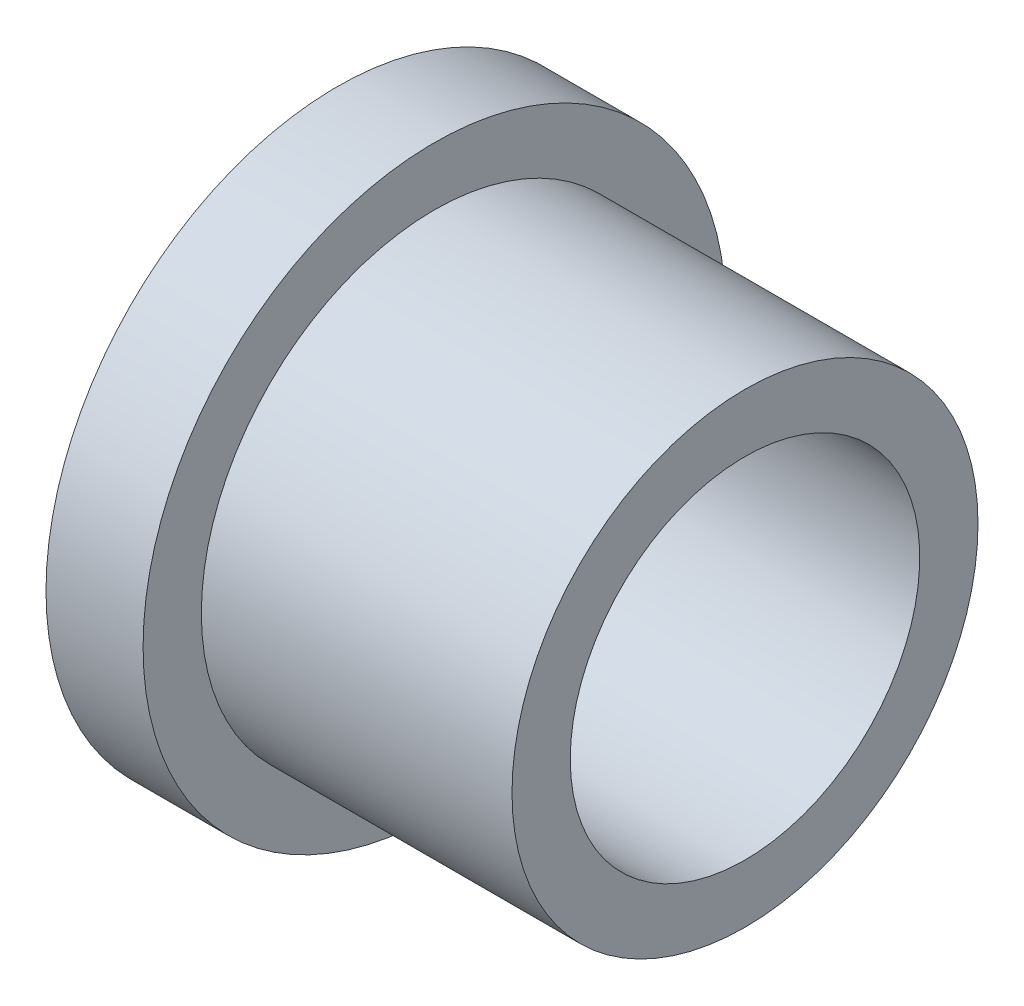
ISO-10303-21;
HEADER;
FILE_DESCRIPTION(('STEP AP214'),'2;1');
FILE_NAME('part.step','',(''),(''),'','','');
FILE_SCHEMA(('AUTOMOTIVE_DESIGN { 1 0 10303 214 1 1 1 1 }'));
ENDSEC;
DATA;
#1=APPLICATION_CONTEXT('core data for automotive mechanical design processes');
#2=APPLICATION_PROTOCOL_DEFINITION('international standard','automotive_design',2000,#1);
#3=PRODUCT_CONTEXT('',#1,'mechanical');
#4=PRODUCT('Part','Part','',(#3));
#5=PRODUCT_RELATED_PRODUCT_CATEGORY('part','',(#4));
#6=PRODUCT_DEFINITION_FORMATION('','',#4);
#7=PRODUCT_DEFINITION_CONTEXT('part definition',#1,'design');
#8=PRODUCT_DEFINITION('design','',#6,#7);
#9=PRODUCT_DEFINITION_SHAPE('','',#8);
#10=(LENGTH_UNIT() NAMED_UNIT(*) SI_UNIT(.MILLI.,.METRE.));
#11=(NAMED_UNIT(*) PLANE_ANGLE_UNIT() SI_UNIT($,.RADIAN.));
#12=(NAMED_UNIT(*) SI_UNIT($,.STERADIAN.) SOLID_ANGLE_UNIT());
#13=UNCERTAINTY_MEASURE_WITH_UNIT(LENGTH_MEASURE(1.E-05),#10,'distance_accuracy_value','');
#14=(GEOMETRIC_REPRESENTATION_CONTEXT(3) GLOBAL_UNCERTAINTY_ASSIGNED_CONTEXT((#13)) GLOBAL_UNIT_ASSIGNED_CONTEXT((#10,
#11,#12)) REPRESENTATION_CONTEXT('',''));
#15=CARTESIAN_POINT('',(0.,0.,0.));
#16=DIRECTION('',(0.,0.,1.));
#17=DIRECTION('',(1.,0.,0.));
#18=AXIS2_PLACEMENT_3D('',#15,#16,#17);
#19=CARTESIAN_POINT('',(-10.5,0.,0.));
#20=DIRECTION('',(-1.,0.,0.));
#21=DIRECTION('',(0.,0.,1.));
#22=AXIS2_PLACEMENT_3D('',#19,#20,#21);
#23=CYLINDRICAL_SURFACE('',#22,15.);
#24=CARTESIAN_POINT('',(-10.5,0.,0.));
#25=DIRECTION('',(-1.,0.,0.));
#26=DIRECTION('',(0.,0.,1.));
#27=AXIS2_PLACEMENT_3D('',#24,#25,#26);
#28=CIRCLE('',#27,15.);
#29=CARTESIAN_POINT('',(-10.5,0.,15.));
#30=VERTEX_POINT('',#29);
#31=EDGE_CURVE('E68',#30,#30,#28,.T.);
#32=ORIENTED_EDGE('',*,*,#31,.F.);
#33=EDGE_LOOP('',(#32));
#34=FACE_BOUND('',#33,.T.);
#35=CARTESIAN_POINT('',(-5.5,0.,0.));
#36=DIRECTION('',(-1.,0.,0.));
#37=DIRECTION('',(0.,0.,1.));
#38=AXIS2_PLACEMENT_3D('',#35,#36,#37);
#39=CIRCLE('',#38,15.);
#40=CARTESIAN_POINT('',(-5.5,0.,15.));
#41=VERTEX_POINT('',#40);
#42=EDGE_CURVE('E10',#41,#41,#39,.T.);
#43=ORIENTED_EDGE('',*,*,#42,.T.);
#44=EDGE_LOOP('',(#43));
#45=FACE_BOUND('',#44,.T.);
#46=ADVANCED_FACE('F41',(#34,#45),#23,.T.);
#47=CARTESIAN_POINT('',(-5.5,15.,0.));
#48=DIRECTION('',(-1.,0.,0.));
#49=DIRECTION('',(0.,0.,1.));
#50=AXIS2_PLACEMENT_3D('',#47,#48,#49);
#51=PLANE('',#50);
#52=ORIENTED_EDGE('',*,*,#42,.F.);
#53=EDGE_LOOP('',(#52));
#54=FACE_BOUND('',#53,.T.);
#55=CARTESIAN_POINT('',(-5.5,0.,0.));
#56=DIRECTION('',(-1.,0.,0.));
#57=DIRECTION('',(0.,0.,1.));
#58=AXIS2_PLACEMENT_3D('',#55,#56,#57);
#59=CIRCLE('',#58,12.);
#60=CARTESIAN_POINT('',(-5.5,0.,12.));
#61=VERTEX_POINT('',#60);
#62=EDGE_CURVE('E48',#61,#61,#59,.T.);
#63=ORIENTED_EDGE('',*,*,#62,.T.);
#64=EDGE_LOOP('',(#63));
#65=FACE_BOUND('',#64,.T.);
#66=ADVANCED_FACE('F76',(#54,#65),#51,.F.);
#67=CARTESIAN_POINT('',(-10.5,0.,0.));
#68=DIRECTION('',(-1.,0.,0.));
#69=DIRECTION('',(0.,0.,1.));
#70=AXIS2_PLACEMENT_3D('',#67,#68,#69);
#71=CYLINDRICAL_SURFACE('',#70,12.);
#72=ORIENTED_EDGE('',*,*,#62,.F.);
#73=EDGE_LOOP('',(#72));
#74=FACE_BOUND('',#73,.T.);
#75=CARTESIAN_POINT('',(10.5,0.,0.));
#76=DIRECTION('',(-1.,0.,0.));
#77=DIRECTION('',(0.,0.,1.));
#78=AXIS2_PLACEMENT_3D('',#75,#76,#77);
#79=CIRCLE('',#78,12.);
#80=CARTESIAN_POINT('',(10.5,0.,12.));
#81=VERTEX_POINT('',#80);
#82=EDGE_CURVE('E53',#81,#81,#79,.T.);
#83=ORIENTED_EDGE('',*,*,#82,.T.);
#84=EDGE_LOOP('',(#83));
#85=FACE_BOUND('',#84,.T.);
#86=ADVANCED_FACE('F80',(#74,#85),#71,.T.);
#87=CARTESIAN_POINT('',(10.5,12.,0.));
#88=DIRECTION('',(-1.,0.,0.));
#89=DIRECTION('',(0.,0.,1.));
#90=AXIS2_PLACEMENT_3D('',#87,#88,#89);
#91=PLANE('',#90);
#92=ORIENTED_EDGE('',*,*,#82,.F.);
#93=EDGE_LOOP('',(#92));
#94=FACE_BOUND('',#93,.T.);
#95=CARTESIAN_POINT('',(10.5,0.,0.));
#96=DIRECTION('',(-1.,0.,0.));
#97=DIRECTION('',(0.,0.,1.));
#98=AXIS2_PLACEMENT_3D('',#95,#96,#97);
#99=CIRCLE('',#98,9.);
#100=CARTESIAN_POINT('',(10.5,0.,9.));
#101=VERTEX_POINT('',#100);
#102=EDGE_CURVE('E58',#101,#101,#99,.T.);
#103=ORIENTED_EDGE('',*,*,#102,.T.);
#104=EDGE_LOOP('',(#103));
#105=FACE_BOUND('',#104,.T.);
#106=ADVANCED_FACE('F85',(#94,#105),#91,.F.);
#107=CARTESIAN_POINT('',(-10.5,0.,0.));
#108=DIRECTION('',(-1.,0.,0.));
#109=DIRECTION('',(0.,0.,1.));
#110=AXIS2_PLACEMENT_3D('',#107,#108,#109);
#111=CYLINDRICAL_SURFACE('',#110,9.);
#112=ORIENTED_EDGE('',*,*,#102,.F.);
#113=EDGE_LOOP('',(#112));
#114=FACE_BOUND('',#113,.T.);
#115=CARTESIAN_POINT('',(-10.5,0.,0.));
#116=DIRECTION('',(-1.,0.,0.));
#117=DIRECTION('',(0.,0.,1.));
#118=AXIS2_PLACEMENT_3D('',#115,#116,#117);
#119=CIRCLE('',#118,9.);
#120=CARTESIAN_POINT('',(-10.5,0.,9.));
#121=VERTEX_POINT('',#120);
#122=EDGE_CURVE('E64',#121,#121,#119,.T.);
#123=ORIENTED_EDGE('',*,*,#122,.T.);
#124=EDGE_LOOP('',(#123));
#125=FACE_BOUND('',#124,.T.);
#126=ADVANCED_FACE('F91',(#114,#125),#111,.F.);
#127=CARTESIAN_POINT('',(-10.5,9.,0.));
#128=DIRECTION('',(1.,0.,0.));
#129=DIRECTION('',(0.,0.,-1.));
#130=AXIS2_PLACEMENT_3D('',#127,#128,#129);
#131=PLANE('',#130);
#132=ORIENTED_EDGE('',*,*,#122,.F.);
#133=EDGE_LOOP('',(#132));
#134=FACE_BOUND('',#133,.T.);
#135=ORIENTED_EDGE('',*,*,#31,.T.);
#136=EDGE_LOOP('',(#135));
#137=FACE_BOUND('',#136,.T.);
#138=ADVANCED_FACE('F73',(#134,#137),#131,.F.);
#139=CLOSED_SHELL('',(#46,#66,#86,#106,#126,#138));
#140=MANIFOLD_SOLID_BREP('B2',#139);
#141=ADVANCED_BREP_SHAPE_REPRESENTATION('',(#18,#140),#14);
#142=SHAPE_DEFINITION_REPRESENTATION(#9,#141);
ENDSEC;
END-ISO-10303-21;
